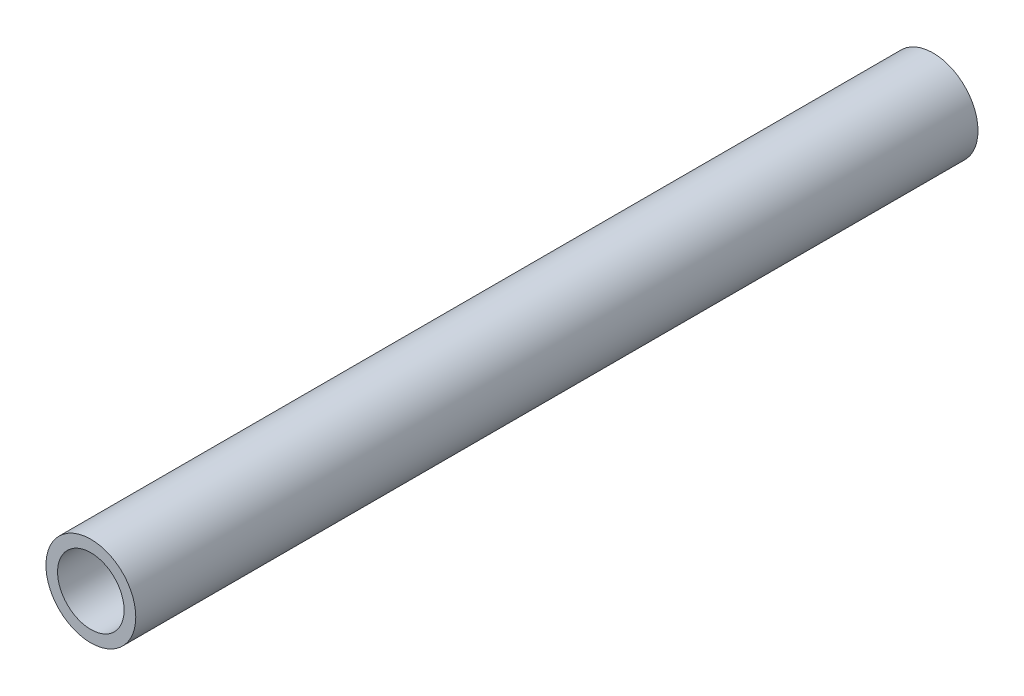
ISO-10303-21;
HEADER;
FILE_DESCRIPTION(('STEP AP214'),'2;1');
FILE_NAME('part.step','',(''),(''),'','','');
FILE_SCHEMA(('AUTOMOTIVE_DESIGN { 1 0 10303 214 1 1 1 1 }'));
ENDSEC;
DATA;
#1=APPLICATION_CONTEXT('core data for automotive mechanical design processes');
#2=APPLICATION_PROTOCOL_DEFINITION('international standard','automotive_design',2000,#1);
#3=PRODUCT_CONTEXT('',#1,'mechanical');
#4=PRODUCT('Part','Part','',(#3));
#5=PRODUCT_RELATED_PRODUCT_CATEGORY('part','',(#4));
#6=PRODUCT_DEFINITION_FORMATION('','',#4);
#7=PRODUCT_DEFINITION_CONTEXT('part definition',#1,'design');
#8=PRODUCT_DEFINITION('design','',#6,#7);
#9=PRODUCT_DEFINITION_SHAPE('','',#8);
#10=(LENGTH_UNIT() NAMED_UNIT(*) SI_UNIT(.MILLI.,.METRE.));
#11=(NAMED_UNIT(*) PLANE_ANGLE_UNIT() SI_UNIT($,.RADIAN.));
#12=(NAMED_UNIT(*) SI_UNIT($,.STERADIAN.) SOLID_ANGLE_UNIT());
#13=UNCERTAINTY_MEASURE_WITH_UNIT(LENGTH_MEASURE(1.E-05),#10,'distance_accuracy_value','');
#14=(GEOMETRIC_REPRESENTATION_CONTEXT(3) GLOBAL_UNCERTAINTY_ASSIGNED_CONTEXT((#13)) GLOBAL_UNIT_ASSIGNED_CONTEXT((#10,
#11,#12)) REPRESENTATION_CONTEXT('',''));
#15=CARTESIAN_POINT('',(0.,0.,0.));
#16=DIRECTION('',(0.,0.,1.));
#17=DIRECTION('',(1.,0.,0.));
#18=AXIS2_PLACEMENT_3D('',#15,#16,#17);
#19=CARTESIAN_POINT('',(0.,0.,100.));
#20=DIRECTION('',(0.,0.,1.));
#21=DIRECTION('',(1.,0.,0.));
#22=AXIS2_PLACEMENT_3D('',#19,#20,#21);
#23=PLANE('',#22);
#24=CARTESIAN_POINT('',(0.,0.,100.));
#25=DIRECTION('',(0.,0.,1.));
#26=DIRECTION('',(1.,0.,0.));
#27=AXIS2_PLACEMENT_3D('',#24,#25,#26);
#28=CIRCLE('',#27,10.668);
#29=CARTESIAN_POINT('',(10.668,0.,100.));
#30=VERTEX_POINT('',#29);
#31=EDGE_CURVE('E11',#30,#30,#28,.T.);
#32=ORIENTED_EDGE('',*,*,#31,.T.);
#33=EDGE_LOOP('',(#32));
#34=FACE_BOUND('',#33,.T.);
#35=CARTESIAN_POINT('',(0.,0.,100.));
#36=DIRECTION('',(0.,0.,1.));
#37=DIRECTION('',(1.,0.,0.));
#38=AXIS2_PLACEMENT_3D('',#35,#36,#37);
#39=CIRCLE('',#38,7.8994);
#40=CARTESIAN_POINT('',(7.8994,0.,100.));
#41=VERTEX_POINT('',#40);
#42=EDGE_CURVE('E56',#41,#41,#39,.T.);
#43=ORIENTED_EDGE('',*,*,#42,.F.);
#44=EDGE_LOOP('',(#43));
#45=FACE_BOUND('',#44,.T.);
#46=ADVANCED_FACE('F43',(#34,#45),#23,.T.);
#47=CARTESIAN_POINT('',(0.,0.,-100.));
#48=DIRECTION('',(0.,0.,1.));
#49=DIRECTION('',(1.,0.,0.));
#50=AXIS2_PLACEMENT_3D('',#47,#48,#49);
#51=PLANE('',#50);
#52=CARTESIAN_POINT('',(0.,0.,-100.));
#53=DIRECTION('',(0.,0.,1.));
#54=DIRECTION('',(1.,0.,0.));
#55=AXIS2_PLACEMENT_3D('',#52,#53,#54);
#56=CIRCLE('',#55,10.668);
#57=CARTESIAN_POINT('',(10.668,0.,-100.));
#58=VERTEX_POINT('',#57);
#59=EDGE_CURVE('E47',#58,#58,#56,.T.);
#60=ORIENTED_EDGE('',*,*,#59,.F.);
#61=EDGE_LOOP('',(#60));
#62=FACE_BOUND('',#61,.T.);
#63=CARTESIAN_POINT('',(0.,0.,-100.));
#64=DIRECTION('',(0.,0.,1.));
#65=DIRECTION('',(1.,0.,0.));
#66=AXIS2_PLACEMENT_3D('',#63,#64,#65);
#67=CIRCLE('',#66,7.8994);
#68=CARTESIAN_POINT('',(7.8994,0.,-100.));
#69=VERTEX_POINT('',#68);
#70=EDGE_CURVE('E58',#69,#69,#67,.T.);
#71=ORIENTED_EDGE('',*,*,#70,.T.);
#72=EDGE_LOOP('',(#71));
#73=FACE_BOUND('',#72,.T.);
#74=ADVANCED_FACE('F70',(#62,#73),#51,.F.);
#75=CARTESIAN_POINT('',(0.,0.,100.));
#76=DIRECTION('',(0.,0.,-1.));
#77=DIRECTION('',(-1.,0.,0.));
#78=AXIS2_PLACEMENT_3D('',#75,#76,#77);
#79=CYLINDRICAL_SURFACE('',#78,10.668);
#80=ORIENTED_EDGE('',*,*,#31,.F.);
#81=EDGE_LOOP('',(#80));
#82=FACE_BOUND('',#81,.T.);
#83=ORIENTED_EDGE('',*,*,#59,.T.);
#84=EDGE_LOOP('',(#83));
#85=FACE_BOUND('',#84,.T.);
#86=ADVANCED_FACE('F45',(#82,#85),#79,.T.);
#87=CARTESIAN_POINT('',(0.,0.,100.));
#88=DIRECTION('',(0.,0.,-1.));
#89=DIRECTION('',(-1.,0.,0.));
#90=AXIS2_PLACEMENT_3D('',#87,#88,#89);
#91=CYLINDRICAL_SURFACE('',#90,7.8994);
#92=ORIENTED_EDGE('',*,*,#42,.T.);
#93=EDGE_LOOP('',(#92));
#94=FACE_BOUND('',#93,.T.);
#95=ORIENTED_EDGE('',*,*,#70,.F.);
#96=EDGE_LOOP('',(#95));
#97=FACE_BOUND('',#96,.T.);
#98=ADVANCED_FACE('F66',(#94,#97),#91,.F.);
#99=CLOSED_SHELL('',(#46,#74,#86,#98));
#100=MANIFOLD_SOLID_BREP('B2',#99);
#101=ADVANCED_BREP_SHAPE_REPRESENTATION('',(#18,#100),#14);
#102=SHAPE_DEFINITION_REPRESENTATION(#9,#101);
ENDSEC;
END-ISO-10303-21;
